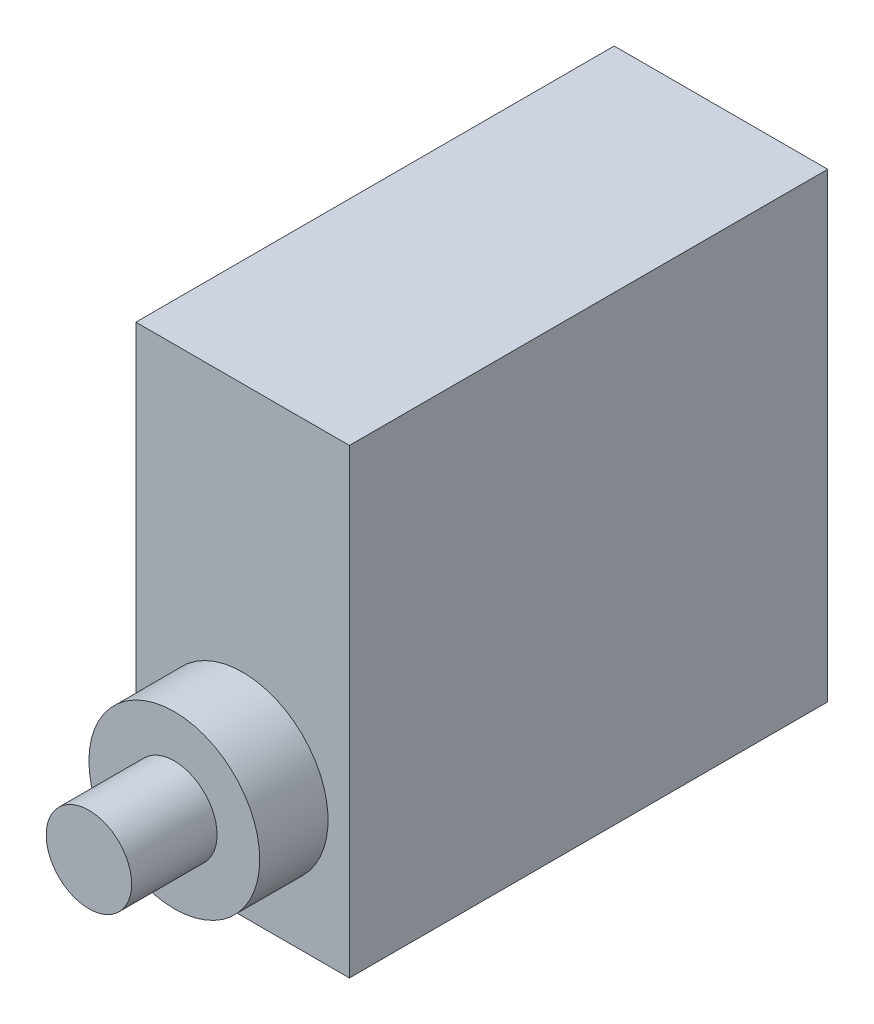
ISO-10303-21;
HEADER;
FILE_DESCRIPTION(('STEP AP214'),'2;1');
FILE_NAME('part.step','',(''),(''),'','','');
FILE_SCHEMA(('AUTOMOTIVE_DESIGN { 1 0 10303 214 1 1 1 1 }'));
ENDSEC;
DATA;
#1=APPLICATION_CONTEXT('core data for automotive mechanical design processes');
#2=APPLICATION_PROTOCOL_DEFINITION('international standard','automotive_design',2000,#1);
#3=PRODUCT_CONTEXT('',#1,'mechanical');
#4=PRODUCT('Part','Part','',(#3));
#5=PRODUCT_RELATED_PRODUCT_CATEGORY('part','',(#4));
#6=PRODUCT_DEFINITION_FORMATION('','',#4);
#7=PRODUCT_DEFINITION_CONTEXT('part definition',#1,'design');
#8=PRODUCT_DEFINITION('design','',#6,#7);
#9=PRODUCT_DEFINITION_SHAPE('','',#8);
#10=(LENGTH_UNIT() NAMED_UNIT(*) SI_UNIT(.MILLI.,.METRE.));
#11=(NAMED_UNIT(*) PLANE_ANGLE_UNIT() SI_UNIT($,.RADIAN.));
#12=(NAMED_UNIT(*) SI_UNIT($,.STERADIAN.) SOLID_ANGLE_UNIT());
#13=UNCERTAINTY_MEASURE_WITH_UNIT(LENGTH_MEASURE(1.E-05),#10,'distance_accuracy_value','');
#14=(GEOMETRIC_REPRESENTATION_CONTEXT(3) GLOBAL_UNCERTAINTY_ASSIGNED_CONTEXT((#13)) GLOBAL_UNIT_ASSIGNED_CONTEXT((#10,
#11,#12)) REPRESENTATION_CONTEXT('',''));
#15=CARTESIAN_POINT('',(0.,0.,0.));
#16=DIRECTION('',(0.,0.,1.));
#17=DIRECTION('',(1.,0.,0.));
#18=AXIS2_PLACEMENT_3D('',#15,#16,#17);
#19=CARTESIAN_POINT('',(0.,0.,28.));
#20=DIRECTION('',(1.,0.,0.));
#21=DIRECTION('',(0.,0.,-1.));
#22=AXIS2_PLACEMENT_3D('',#19,#20,#21);
#23=PLANE('',#22);
#24=DIRECTION('',(0.,-1.,0.));
#25=VECTOR('',#24,1.);
#26=CARTESIAN_POINT('',(0.,0.,0.));
#27=LINE('',#26,#25);
#28=CARTESIAN_POINT('',(0.,27.,0.));
#29=VERTEX_POINT('',#28);
#30=CARTESIAN_POINT('',(0.,0.,0.));
#31=VERTEX_POINT('',#30);
#32=EDGE_CURVE('E101',#29,#31,#27,.T.);
#33=ORIENTED_EDGE('',*,*,#32,.T.);
#34=DIRECTION('',(0.,0.,-1.));
#35=VECTOR('',#34,1.);
#36=CARTESIAN_POINT('',(0.,0.,28.));
#37=LINE('',#36,#35);
#38=CARTESIAN_POINT('',(0.,0.,28.));
#39=VERTEX_POINT('',#38);
#40=EDGE_CURVE('E92',#39,#31,#37,.T.);
#41=ORIENTED_EDGE('',*,*,#40,.F.);
#42=DIRECTION('',(0.,-1.,0.));
#43=VECTOR('',#42,1.);
#44=CARTESIAN_POINT('',(0.,0.,28.));
#45=LINE('',#44,#43);
#46=CARTESIAN_POINT('',(0.,27.,28.));
#47=VERTEX_POINT('',#46);
#48=EDGE_CURVE('E86',#47,#39,#45,.T.);
#49=ORIENTED_EDGE('',*,*,#48,.F.);
#50=DIRECTION('',(0.,0.,-1.));
#51=VECTOR('',#50,1.);
#52=CARTESIAN_POINT('',(0.,27.,28.));
#53=LINE('',#52,#51);
#54=EDGE_CURVE('E97',#47,#29,#53,.T.);
#55=ORIENTED_EDGE('',*,*,#54,.T.);
#56=EDGE_LOOP('',(#33,#41,#49,#55));
#57=FACE_BOUND('',#56,.T.);
#58=ADVANCED_FACE('F33',(#57),#23,.F.);
#59=CARTESIAN_POINT('',(0.,0.,28.));
#60=DIRECTION('',(0.,1.,0.));
#61=DIRECTION('',(0.,0.,1.));
#62=AXIS2_PLACEMENT_3D('',#59,#60,#61);
#63=PLANE('',#62);
#64=DIRECTION('',(1.,0.,0.));
#65=VECTOR('',#64,1.);
#66=CARTESIAN_POINT('',(0.,0.,0.));
#67=LINE('',#66,#65);
#68=CARTESIAN_POINT('',(12.5,0.,0.));
#69=VERTEX_POINT('',#68);
#70=EDGE_CURVE('E91',#31,#69,#67,.T.);
#71=ORIENTED_EDGE('',*,*,#70,.T.);
#72=DIRECTION('',(0.,0.,-1.));
#73=VECTOR('',#72,1.);
#74=CARTESIAN_POINT('',(12.5,0.,28.));
#75=LINE('',#74,#73);
#76=CARTESIAN_POINT('',(12.5,0.,28.));
#77=VERTEX_POINT('',#76);
#78=EDGE_CURVE('E89',#77,#69,#75,.T.);
#79=ORIENTED_EDGE('',*,*,#78,.F.);
#80=DIRECTION('',(1.,0.,0.));
#81=VECTOR('',#80,1.);
#82=CARTESIAN_POINT('',(0.,0.,28.));
#83=LINE('',#82,#81);
#84=EDGE_CURVE('E81',#39,#77,#83,.T.);
#85=ORIENTED_EDGE('',*,*,#84,.F.);
#86=ORIENTED_EDGE('',*,*,#40,.T.);
#87=EDGE_LOOP('',(#71,#79,#85,#86));
#88=FACE_BOUND('',#87,.T.);
#89=ADVANCED_FACE('F90',(#88),#63,.F.);
#90=CARTESIAN_POINT('',(12.5,0.,28.));
#91=DIRECTION('',(-1.,0.,0.));
#92=DIRECTION('',(0.,0.,1.));
#93=AXIS2_PLACEMENT_3D('',#90,#91,#92);
#94=PLANE('',#93);
#95=DIRECTION('',(0.,1.,0.));
#96=VECTOR('',#95,1.);
#97=CARTESIAN_POINT('',(12.5,0.,0.));
#98=LINE('',#97,#96);
#99=CARTESIAN_POINT('',(12.5,27.,0.));
#100=VERTEX_POINT('',#99);
#101=EDGE_CURVE('E67',#69,#100,#98,.T.);
#102=ORIENTED_EDGE('',*,*,#101,.T.);
#103=DIRECTION('',(0.,0.,-1.));
#104=VECTOR('',#103,1.);
#105=CARTESIAN_POINT('',(12.5,27.,28.));
#106=LINE('',#105,#104);
#107=CARTESIAN_POINT('',(12.5,27.,28.));
#108=VERTEX_POINT('',#107);
#109=EDGE_CURVE('E93',#108,#100,#106,.T.);
#110=ORIENTED_EDGE('',*,*,#109,.F.);
#111=DIRECTION('',(0.,1.,0.));
#112=VECTOR('',#111,1.);
#113=CARTESIAN_POINT('',(12.5,0.,28.));
#114=LINE('',#113,#112);
#115=EDGE_CURVE('E84',#77,#108,#114,.T.);
#116=ORIENTED_EDGE('',*,*,#115,.F.);
#117=ORIENTED_EDGE('',*,*,#78,.T.);
#118=EDGE_LOOP('',(#102,#110,#116,#117));
#119=FACE_BOUND('',#118,.T.);
#120=ADVANCED_FACE('F95',(#119),#94,.F.);
#121=CARTESIAN_POINT('',(0.,27.,28.));
#122=DIRECTION('',(0.,-1.,0.));
#123=DIRECTION('',(0.,0.,-1.));
#124=AXIS2_PLACEMENT_3D('',#121,#122,#123);
#125=PLANE('',#124);
#126=DIRECTION('',(-1.,0.,0.));
#127=VECTOR('',#126,1.);
#128=CARTESIAN_POINT('',(0.,27.,0.));
#129=LINE('',#128,#127);
#130=EDGE_CURVE('E73',#100,#29,#129,.T.);
#131=ORIENTED_EDGE('',*,*,#130,.T.);
#132=ORIENTED_EDGE('',*,*,#54,.F.);
#133=DIRECTION('',(-1.,0.,0.));
#134=VECTOR('',#133,1.);
#135=CARTESIAN_POINT('',(0.,27.,28.));
#136=LINE('',#135,#134);
#137=EDGE_CURVE('E50',#108,#47,#136,.T.);
#138=ORIENTED_EDGE('',*,*,#137,.F.);
#139=ORIENTED_EDGE('',*,*,#109,.T.);
#140=EDGE_LOOP('',(#131,#132,#138,#139));
#141=FACE_BOUND('',#140,.T.);
#142=ADVANCED_FACE('F116',(#141),#125,.F.);
#143=CARTESIAN_POINT('',(0.,0.,28.));
#144=DIRECTION('',(0.,0.,-1.));
#145=DIRECTION('',(-1.,0.,0.));
#146=AXIS2_PLACEMENT_3D('',#143,#144,#145);
#147=PLANE('',#146);
#148=CARTESIAN_POINT('',(6.25,7.38133316337046,28.));
#149=DIRECTION('',(0.,0.,-1.));
#150=DIRECTION('',(-1.,0.,0.));
#151=AXIS2_PLACEMENT_3D('',#148,#149,#150);
#152=CIRCLE('',#151,5.);
#153=CARTESIAN_POINT('',(1.25,7.38133316337046,28.));
#154=VERTEX_POINT('',#153);
#155=EDGE_CURVE('E36',#154,#154,#152,.F.);
#156=ORIENTED_EDGE('',*,*,#155,.F.);
#157=EDGE_LOOP('',(#156));
#158=FACE_BOUND('',#157,.T.);
#159=ORIENTED_EDGE('',*,*,#48,.T.);
#160=ORIENTED_EDGE('',*,*,#84,.T.);
#161=ORIENTED_EDGE('',*,*,#115,.T.);
#162=ORIENTED_EDGE('',*,*,#137,.T.);
#163=EDGE_LOOP('',(#159,#160,#161,#162));
#164=FACE_BOUND('',#163,.T.);
#165=ADVANCED_FACE('F82',(#158,#164),#147,.F.);
#166=CARTESIAN_POINT('',(0.,0.,0.));
#167=DIRECTION('',(0.,0.,-1.));
#168=DIRECTION('',(-1.,0.,0.));
#169=AXIS2_PLACEMENT_3D('',#166,#167,#168);
#170=PLANE('',#169);
#171=ORIENTED_EDGE('',*,*,#32,.F.);
#172=ORIENTED_EDGE('',*,*,#130,.F.);
#173=ORIENTED_EDGE('',*,*,#101,.F.);
#174=ORIENTED_EDGE('',*,*,#70,.F.);
#175=EDGE_LOOP('',(#171,#172,#173,#174));
#176=FACE_BOUND('',#175,.T.);
#177=ADVANCED_FACE('F115',(#176),#170,.T.);
#178=CARTESIAN_POINT('',(6.25,7.38133316337046,32.));
#179=DIRECTION('',(0.,0.,-1.));
#180=DIRECTION('',(-1.,0.,0.));
#181=AXIS2_PLACEMENT_3D('',#178,#179,#180);
#182=CYLINDRICAL_SURFACE('',#181,5.);
#183=CARTESIAN_POINT('',(6.25,7.38133316337046,32.));
#184=DIRECTION('',(0.,0.,1.));
#185=DIRECTION('',(1.,0.,0.));
#186=AXIS2_PLACEMENT_3D('',#183,#184,#185);
#187=CIRCLE('',#186,5.);
#188=CARTESIAN_POINT('',(11.25,7.38133316337046,32.));
#189=VERTEX_POINT('',#188);
#190=EDGE_CURVE('E104',#189,#189,#187,.T.);
#191=ORIENTED_EDGE('',*,*,#190,.F.);
#192=EDGE_LOOP('',(#191));
#193=FACE_BOUND('',#192,.T.);
#194=ORIENTED_EDGE('',*,*,#155,.T.);
#195=EDGE_LOOP('',(#194));
#196=FACE_BOUND('',#195,.T.);
#197=ADVANCED_FACE('F112',(#193,#196),#182,.T.);
#198=CARTESIAN_POINT('',(6.25,7.38133316337046,32.));
#199=DIRECTION('',(0.,0.,1.));
#200=DIRECTION('',(1.,0.,0.));
#201=AXIS2_PLACEMENT_3D('',#198,#199,#200);
#202=PLANE('',#201);
#203=CARTESIAN_POINT('',(6.25,7.38133316337046,32.));
#204=DIRECTION('',(0.,0.,1.));
#205=DIRECTION('',(1.,0.,0.));
#206=AXIS2_PLACEMENT_3D('',#203,#204,#205);
#207=CIRCLE('',#206,2.5);
#208=CARTESIAN_POINT('',(8.75,7.38133316337046,32.));
#209=VERTEX_POINT('',#208);
#210=EDGE_CURVE('E11',#209,#209,#207,.T.);
#211=ORIENTED_EDGE('',*,*,#210,.F.);
#212=EDGE_LOOP('',(#211));
#213=FACE_BOUND('',#212,.T.);
#214=ORIENTED_EDGE('',*,*,#190,.T.);
#215=EDGE_LOOP('',(#214));
#216=FACE_BOUND('',#215,.T.);
#217=ADVANCED_FACE('F144',(#213,#216),#202,.T.);
#218=CARTESIAN_POINT('',(6.25,7.38133316337046,37.));
#219=DIRECTION('',(0.,0.,-1.));
#220=DIRECTION('',(-1.,0.,0.));
#221=AXIS2_PLACEMENT_3D('',#218,#219,#220);
#222=CYLINDRICAL_SURFACE('',#221,2.5);
#223=CARTESIAN_POINT('',(6.25,7.38133316337046,37.));
#224=DIRECTION('',(0.,0.,1.));
#225=DIRECTION('',(1.,0.,0.));
#226=AXIS2_PLACEMENT_3D('',#223,#224,#225);
#227=CIRCLE('',#226,2.5);
#228=CARTESIAN_POINT('',(8.75,7.38133316337046,37.));
#229=VERTEX_POINT('',#228);
#230=EDGE_CURVE('E134',#229,#229,#227,.T.);
#231=ORIENTED_EDGE('',*,*,#230,.F.);
#232=EDGE_LOOP('',(#231));
#233=FACE_BOUND('',#232,.T.);
#234=ORIENTED_EDGE('',*,*,#210,.T.);
#235=EDGE_LOOP('',(#234));
#236=FACE_BOUND('',#235,.T.);
#237=ADVANCED_FACE('F141',(#233,#236),#222,.T.);
#238=CARTESIAN_POINT('',(6.25,7.38133316337046,37.));
#239=DIRECTION('',(0.,0.,1.));
#240=DIRECTION('',(1.,0.,0.));
#241=AXIS2_PLACEMENT_3D('',#238,#239,#240);
#242=PLANE('',#241);
#243=ORIENTED_EDGE('',*,*,#230,.T.);
#244=EDGE_LOOP('',(#243));
#245=FACE_BOUND('',#244,.T.);
#246=ADVANCED_FACE('F139',(#245),#242,.T.);
#247=CLOSED_SHELL('',(#58,#89,#120,#142,#165,#177,#197,#217,#237,#246));
#248=MANIFOLD_SOLID_BREP('B2',#247);
#249=ADVANCED_BREP_SHAPE_REPRESENTATION('',(#18,#248),#14);
#250=SHAPE_DEFINITION_REPRESENTATION(#9,#249);
ENDSEC;
END-ISO-10303-21;
